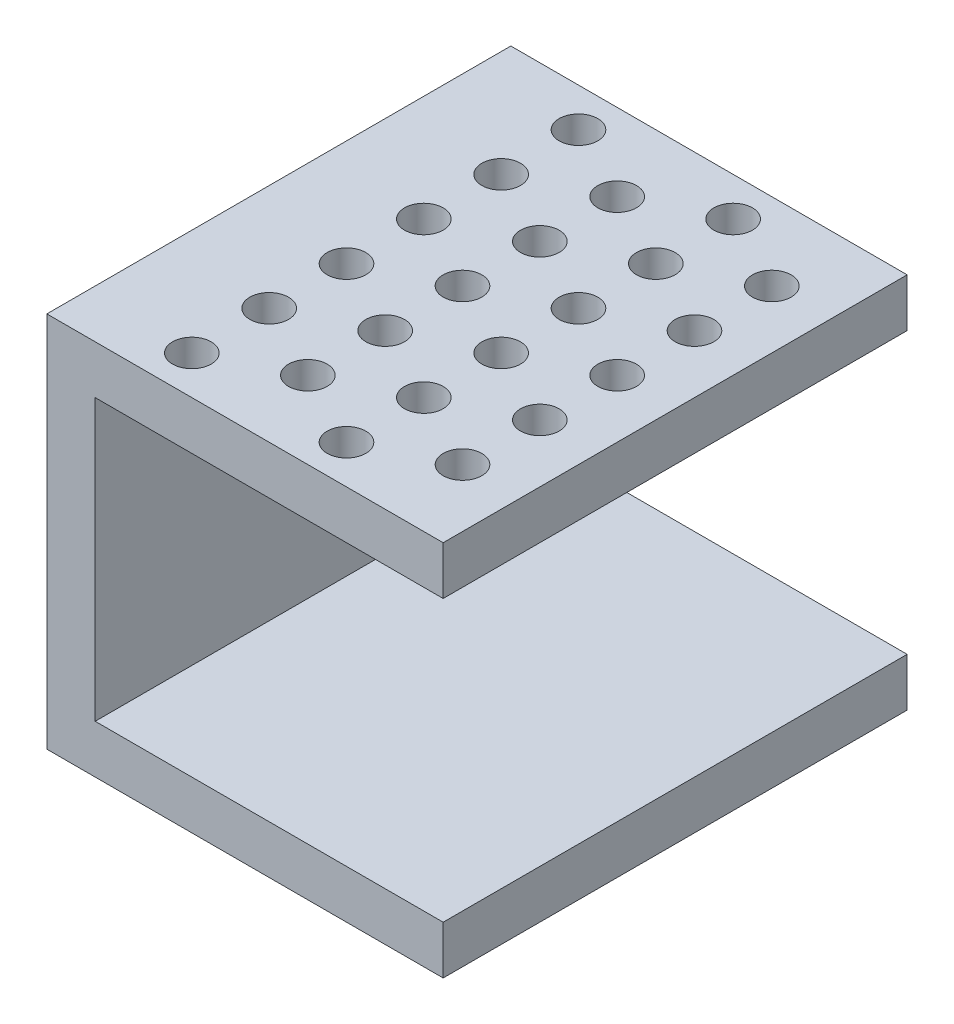
ISO-10303-21;
HEADER;
FILE_DESCRIPTION(('STEP AP214'),'2;1');
FILE_NAME('part.step','',(''),(''),'','','');
FILE_SCHEMA(('AUTOMOTIVE_DESIGN { 1 0 10303 214 1 1 1 1 }'));
ENDSEC;
DATA;
#1=APPLICATION_CONTEXT('core data for automotive mechanical design processes');
#2=APPLICATION_PROTOCOL_DEFINITION('international standard','automotive_design',2000,#1);
#3=PRODUCT_CONTEXT('',#1,'mechanical');
#4=PRODUCT('Part','Part','',(#3));
#5=PRODUCT_RELATED_PRODUCT_CATEGORY('part','',(#4));
#6=PRODUCT_DEFINITION_FORMATION('','',#4);
#7=PRODUCT_DEFINITION_CONTEXT('part definition',#1,'design');
#8=PRODUCT_DEFINITION('design','',#6,#7);
#9=PRODUCT_DEFINITION_SHAPE('','',#8);
#10=(LENGTH_UNIT() NAMED_UNIT(*) SI_UNIT(.MILLI.,.METRE.));
#11=(NAMED_UNIT(*) PLANE_ANGLE_UNIT() SI_UNIT($,.RADIAN.));
#12=(NAMED_UNIT(*) SI_UNIT($,.STERADIAN.) SOLID_ANGLE_UNIT());
#13=UNCERTAINTY_MEASURE_WITH_UNIT(LENGTH_MEASURE(1.E-05),#10,'distance_accuracy_value','');
#14=(GEOMETRIC_REPRESENTATION_CONTEXT(3) GLOBAL_UNCERTAINTY_ASSIGNED_CONTEXT((#13)) GLOBAL_UNIT_ASSIGNED_CONTEXT((#10,
#11,#12)) REPRESENTATION_CONTEXT('',''));
#15=CARTESIAN_POINT('',(0.,0.,0.));
#16=DIRECTION('',(0.,0.,1.));
#17=DIRECTION('',(1.,0.,0.));
#18=AXIS2_PLACEMENT_3D('',#15,#16,#17);
#19=CARTESIAN_POINT('',(-20.,-17.,8.));
#20=DIRECTION('',(-1.,0.,0.));
#21=DIRECTION('',(0.,0.,1.));
#22=AXIS2_PLACEMENT_3D('',#19,#20,#21);
#23=PLANE('',#22);
#24=DIRECTION('',(0.,0.,1.));
#25=VECTOR('',#24,1.);
#26=CARTESIAN_POINT('',(-20.,-14.5,8.));
#27=LINE('',#26,#25);
#28=CARTESIAN_POINT('',(-20.,-14.5,-16.));
#29=VERTEX_POINT('',#28);
#30=CARTESIAN_POINT('',(-20.,-14.5,8.));
#31=VERTEX_POINT('',#30);
#32=EDGE_CURVE('E258',#29,#31,#27,.T.);
#33=ORIENTED_EDGE('',*,*,#32,.F.);
#34=DIRECTION('',(0.,1.,0.));
#35=VECTOR('',#34,1.);
#36=CARTESIAN_POINT('',(-20.,-17.,-16.));
#37=LINE('',#36,#35);
#38=CARTESIAN_POINT('',(-20.,0.,-16.));
#39=VERTEX_POINT('',#38);
#40=EDGE_CURVE('E50',#29,#39,#37,.T.);
#41=ORIENTED_EDGE('',*,*,#40,.T.);
#42=DIRECTION('',(0.,0.,1.));
#43=VECTOR('',#42,1.);
#44=CARTESIAN_POINT('',(-20.,0.,8.));
#45=LINE('',#44,#43);
#46=CARTESIAN_POINT('',(-20.,0.,8.));
#47=VERTEX_POINT('',#46);
#48=EDGE_CURVE('E88',#39,#47,#45,.T.);
#49=ORIENTED_EDGE('',*,*,#48,.T.);
#50=DIRECTION('',(0.,1.,0.));
#51=VECTOR('',#50,1.);
#52=CARTESIAN_POINT('',(-20.,-17.,8.));
#53=LINE('',#52,#51);
#54=EDGE_CURVE('E237',#31,#47,#53,.T.);
#55=ORIENTED_EDGE('',*,*,#54,.F.);
#56=EDGE_LOOP('',(#33,#41,#49,#55));
#57=FACE_BOUND('',#56,.T.);
#58=ADVANCED_FACE('F35',(#57),#23,.F.);
#59=CARTESIAN_POINT('',(0.,0.,0.));
#60=DIRECTION('',(0.,1.,0.));
#61=DIRECTION('',(0.,0.,1.));
#62=AXIS2_PLACEMENT_3D('',#59,#60,#61);
#63=PLANE('',#62);
#64=CARTESIAN_POINT('',(-5.,0.,-12.));
#65=DIRECTION('',(0.,1.,0.));
#66=DIRECTION('',(0.,0.,1.));
#67=AXIS2_PLACEMENT_3D('',#64,#65,#66);
#68=CIRCLE('',#67,1.);
#69=CARTESIAN_POINT('',(-5.,0.,-11.));
#70=VERTEX_POINT('',#69);
#71=EDGE_CURVE('E223',#70,#70,#68,.T.);
#72=ORIENTED_EDGE('',*,*,#71,.T.);
#73=EDGE_LOOP('',(#72));
#74=FACE_BOUND('',#73,.T.);
#75=CARTESIAN_POINT('',(-5.,0.,-8.));
#76=DIRECTION('',(0.,1.,0.));
#77=DIRECTION('',(0.,0.,1.));
#78=AXIS2_PLACEMENT_3D('',#75,#76,#77);
#79=CIRCLE('',#78,1.);
#80=CARTESIAN_POINT('',(-5.,0.,-7.));
#81=VERTEX_POINT('',#80);
#82=EDGE_CURVE('E217',#81,#81,#79,.T.);
#83=ORIENTED_EDGE('',*,*,#82,.T.);
#84=EDGE_LOOP('',(#83));
#85=FACE_BOUND('',#84,.T.);
#86=CARTESIAN_POINT('',(-5.,0.,-4.));
#87=DIRECTION('',(0.,1.,0.));
#88=DIRECTION('',(0.,0.,1.));
#89=AXIS2_PLACEMENT_3D('',#86,#87,#88);
#90=CIRCLE('',#89,1.);
#91=CARTESIAN_POINT('',(-5.,0.,-3.));
#92=VERTEX_POINT('',#91);
#93=EDGE_CURVE('E211',#92,#92,#90,.T.);
#94=ORIENTED_EDGE('',*,*,#93,.T.);
#95=EDGE_LOOP('',(#94));
#96=FACE_BOUND('',#95,.T.);
#97=CARTESIAN_POINT('',(-5.,0.,0.));
#98=DIRECTION('',(0.,1.,0.));
#99=DIRECTION('',(0.,0.,1.));
#100=AXIS2_PLACEMENT_3D('',#97,#98,#99);
#101=CIRCLE('',#100,1.);
#102=CARTESIAN_POINT('',(-5.,0.,1.));
#103=VERTEX_POINT('',#102);
#104=EDGE_CURVE('E205',#103,#103,#101,.T.);
#105=ORIENTED_EDGE('',*,*,#104,.T.);
#106=EDGE_LOOP('',(#105));
#107=FACE_BOUND('',#106,.T.);
#108=CARTESIAN_POINT('',(-5.,0.,4.));
#109=DIRECTION('',(0.,1.,0.));
#110=DIRECTION('',(0.,0.,1.));
#111=AXIS2_PLACEMENT_3D('',#108,#109,#110);
#112=CIRCLE('',#111,1.);
#113=CARTESIAN_POINT('',(-5.,0.,5.));
#114=VERTEX_POINT('',#113);
#115=EDGE_CURVE('E199',#114,#114,#112,.T.);
#116=ORIENTED_EDGE('',*,*,#115,.T.);
#117=EDGE_LOOP('',(#116));
#118=FACE_BOUND('',#117,.T.);
#119=CARTESIAN_POINT('',(-9.,0.,-14.));
#120=DIRECTION('',(0.,1.,0.));
#121=DIRECTION('',(0.,0.,1.));
#122=AXIS2_PLACEMENT_3D('',#119,#120,#121);
#123=CIRCLE('',#122,1.);
#124=CARTESIAN_POINT('',(-9.,0.,-13.));
#125=VERTEX_POINT('',#124);
#126=EDGE_CURVE('E193',#125,#125,#123,.T.);
#127=ORIENTED_EDGE('',*,*,#126,.T.);
#128=EDGE_LOOP('',(#127));
#129=FACE_BOUND('',#128,.T.);
#130=CARTESIAN_POINT('',(-9.,0.,-10.));
#131=DIRECTION('',(0.,1.,0.));
#132=DIRECTION('',(0.,0.,1.));
#133=AXIS2_PLACEMENT_3D('',#130,#131,#132);
#134=CIRCLE('',#133,1.);
#135=CARTESIAN_POINT('',(-9.,0.,-9.));
#136=VERTEX_POINT('',#135);
#137=EDGE_CURVE('E187',#136,#136,#134,.T.);
#138=ORIENTED_EDGE('',*,*,#137,.T.);
#139=EDGE_LOOP('',(#138));
#140=FACE_BOUND('',#139,.T.);
#141=CARTESIAN_POINT('',(-9.,0.,-6.));
#142=DIRECTION('',(0.,1.,0.));
#143=DIRECTION('',(0.,0.,1.));
#144=AXIS2_PLACEMENT_3D('',#141,#142,#143);
#145=CIRCLE('',#144,1.);
#146=CARTESIAN_POINT('',(-9.,0.,-5.));
#147=VERTEX_POINT('',#146);
#148=EDGE_CURVE('E181',#147,#147,#145,.T.);
#149=ORIENTED_EDGE('',*,*,#148,.T.);
#150=EDGE_LOOP('',(#149));
#151=FACE_BOUND('',#150,.T.);
#152=CARTESIAN_POINT('',(-9.,0.,-2.));
#153=DIRECTION('',(0.,1.,0.));
#154=DIRECTION('',(0.,0.,1.));
#155=AXIS2_PLACEMENT_3D('',#152,#153,#154);
#156=CIRCLE('',#155,1.);
#157=CARTESIAN_POINT('',(-9.,0.,-0.999999999999999));
#158=VERTEX_POINT('',#157);
#159=EDGE_CURVE('E175',#158,#158,#156,.T.);
#160=ORIENTED_EDGE('',*,*,#159,.T.);
#161=EDGE_LOOP('',(#160));
#162=FACE_BOUND('',#161,.T.);
#163=CARTESIAN_POINT('',(-9.,0.,2.));
#164=DIRECTION('',(0.,1.,0.));
#165=DIRECTION('',(0.,0.,1.));
#166=AXIS2_PLACEMENT_3D('',#163,#164,#165);
#167=CIRCLE('',#166,1.);
#168=CARTESIAN_POINT('',(-9.,0.,3.));
#169=VERTEX_POINT('',#168);
#170=EDGE_CURVE('E169',#169,#169,#167,.T.);
#171=ORIENTED_EDGE('',*,*,#170,.T.);
#172=EDGE_LOOP('',(#171));
#173=FACE_BOUND('',#172,.T.);
#174=CARTESIAN_POINT('',(-9.,0.,6.));
#175=DIRECTION('',(0.,1.,0.));
#176=DIRECTION('',(0.,0.,1.));
#177=AXIS2_PLACEMENT_3D('',#174,#175,#176);
#178=CIRCLE('',#177,1.);
#179=CARTESIAN_POINT('',(-9.,0.,7.));
#180=VERTEX_POINT('',#179);
#181=EDGE_CURVE('E163',#180,#180,#178,.T.);
#182=ORIENTED_EDGE('',*,*,#181,.T.);
#183=EDGE_LOOP('',(#182));
#184=FACE_BOUND('',#183,.T.);
#185=CARTESIAN_POINT('',(-13.,0.,-12.));
#186=DIRECTION('',(0.,1.,0.));
#187=DIRECTION('',(0.,0.,1.));
#188=AXIS2_PLACEMENT_3D('',#185,#186,#187);
#189=CIRCLE('',#188,1.);
#190=CARTESIAN_POINT('',(-13.,0.,-11.));
#191=VERTEX_POINT('',#190);
#192=EDGE_CURVE('E157',#191,#191,#189,.T.);
#193=ORIENTED_EDGE('',*,*,#192,.T.);
#194=EDGE_LOOP('',(#193));
#195=FACE_BOUND('',#194,.T.);
#196=CARTESIAN_POINT('',(-13.,0.,-8.));
#197=DIRECTION('',(0.,1.,0.));
#198=DIRECTION('',(0.,0.,1.));
#199=AXIS2_PLACEMENT_3D('',#196,#197,#198);
#200=CIRCLE('',#199,1.00000000000001);
#201=CARTESIAN_POINT('',(-13.,0.,-6.99999999999999));
#202=VERTEX_POINT('',#201);
#203=EDGE_CURVE('E151',#202,#202,#200,.T.);
#204=ORIENTED_EDGE('',*,*,#203,.T.);
#205=EDGE_LOOP('',(#204));
#206=FACE_BOUND('',#205,.T.);
#207=CARTESIAN_POINT('',(-13.,0.,-4.));
#208=DIRECTION('',(0.,1.,0.));
#209=DIRECTION('',(0.,0.,1.));
#210=AXIS2_PLACEMENT_3D('',#207,#208,#209);
#211=CIRCLE('',#210,1.);
#212=CARTESIAN_POINT('',(-13.,0.,-3.));
#213=VERTEX_POINT('',#212);
#214=EDGE_CURVE('E145',#213,#213,#211,.T.);
#215=ORIENTED_EDGE('',*,*,#214,.T.);
#216=EDGE_LOOP('',(#215));
#217=FACE_BOUND('',#216,.T.);
#218=CARTESIAN_POINT('',(-13.,0.,0.));
#219=DIRECTION('',(0.,1.,0.));
#220=DIRECTION('',(0.,0.,1.));
#221=AXIS2_PLACEMENT_3D('',#218,#219,#220);
#222=CIRCLE('',#221,1.);
#223=CARTESIAN_POINT('',(-13.,0.,1.));
#224=VERTEX_POINT('',#223);
#225=EDGE_CURVE('E139',#224,#224,#222,.T.);
#226=ORIENTED_EDGE('',*,*,#225,.T.);
#227=EDGE_LOOP('',(#226));
#228=FACE_BOUND('',#227,.T.);
#229=CARTESIAN_POINT('',(-13.,0.,4.));
#230=DIRECTION('',(0.,1.,0.));
#231=DIRECTION('',(0.,0.,1.));
#232=AXIS2_PLACEMENT_3D('',#229,#230,#231);
#233=CIRCLE('',#232,1.);
#234=CARTESIAN_POINT('',(-13.,0.,5.));
#235=VERTEX_POINT('',#234);
#236=EDGE_CURVE('E133',#235,#235,#233,.T.);
#237=ORIENTED_EDGE('',*,*,#236,.T.);
#238=EDGE_LOOP('',(#237));
#239=FACE_BOUND('',#238,.T.);
#240=CARTESIAN_POINT('',(-17.,0.,-14.));
#241=DIRECTION('',(0.,1.,0.));
#242=DIRECTION('',(0.,0.,1.));
#243=AXIS2_PLACEMENT_3D('',#240,#241,#242);
#244=CIRCLE('',#243,1.);
#245=CARTESIAN_POINT('',(-17.,0.,-13.));
#246=VERTEX_POINT('',#245);
#247=EDGE_CURVE('E127',#246,#246,#244,.T.);
#248=ORIENTED_EDGE('',*,*,#247,.T.);
#249=EDGE_LOOP('',(#248));
#250=FACE_BOUND('',#249,.T.);
#251=CARTESIAN_POINT('',(-17.,0.,-10.));
#252=DIRECTION('',(0.,1.,0.));
#253=DIRECTION('',(0.,0.,1.));
#254=AXIS2_PLACEMENT_3D('',#251,#252,#253);
#255=CIRCLE('',#254,1.);
#256=CARTESIAN_POINT('',(-17.,0.,-9.));
#257=VERTEX_POINT('',#256);
#258=EDGE_CURVE('E121',#257,#257,#255,.T.);
#259=ORIENTED_EDGE('',*,*,#258,.T.);
#260=EDGE_LOOP('',(#259));
#261=FACE_BOUND('',#260,.T.);
#262=CARTESIAN_POINT('',(-17.,0.,-6.));
#263=DIRECTION('',(0.,1.,0.));
#264=DIRECTION('',(0.,0.,1.));
#265=AXIS2_PLACEMENT_3D('',#262,#263,#264);
#266=CIRCLE('',#265,1.);
#267=CARTESIAN_POINT('',(-17.,0.,-5.));
#268=VERTEX_POINT('',#267);
#269=EDGE_CURVE('E115',#268,#268,#266,.T.);
#270=ORIENTED_EDGE('',*,*,#269,.T.);
#271=EDGE_LOOP('',(#270));
#272=FACE_BOUND('',#271,.T.);
#273=CARTESIAN_POINT('',(-17.,0.,-2.));
#274=DIRECTION('',(0.,1.,0.));
#275=DIRECTION('',(0.,0.,1.));
#276=AXIS2_PLACEMENT_3D('',#273,#274,#275);
#277=CIRCLE('',#276,1.);
#278=CARTESIAN_POINT('',(-17.,0.,-0.999999999999999));
#279=VERTEX_POINT('',#278);
#280=EDGE_CURVE('E109',#279,#279,#277,.T.);
#281=ORIENTED_EDGE('',*,*,#280,.T.);
#282=EDGE_LOOP('',(#281));
#283=FACE_BOUND('',#282,.T.);
#284=CARTESIAN_POINT('',(-17.,0.,2.));
#285=DIRECTION('',(0.,1.,0.));
#286=DIRECTION('',(0.,0.,1.));
#287=AXIS2_PLACEMENT_3D('',#284,#285,#286);
#288=CIRCLE('',#287,1.);
#289=CARTESIAN_POINT('',(-17.,0.,3.));
#290=VERTEX_POINT('',#289);
#291=EDGE_CURVE('E103',#290,#290,#288,.T.);
#292=ORIENTED_EDGE('',*,*,#291,.T.);
#293=EDGE_LOOP('',(#292));
#294=FACE_BOUND('',#293,.T.);
#295=CARTESIAN_POINT('',(-17.,0.,6.));
#296=DIRECTION('',(0.,1.,0.));
#297=DIRECTION('',(0.,0.,1.));
#298=AXIS2_PLACEMENT_3D('',#295,#296,#297);
#299=CIRCLE('',#298,1.);
#300=CARTESIAN_POINT('',(-17.,0.,7.));
#301=VERTEX_POINT('',#300);
#302=EDGE_CURVE('E97',#301,#301,#299,.T.);
#303=ORIENTED_EDGE('',*,*,#302,.T.);
#304=EDGE_LOOP('',(#303));
#305=FACE_BOUND('',#304,.T.);
#306=ORIENTED_EDGE('',*,*,#48,.F.);
#307=DIRECTION('',(-1.,0.,0.));
#308=VECTOR('',#307,1.);
#309=CARTESIAN_POINT('',(-20.,0.,-16.));
#310=LINE('',#309,#308);
#311=CARTESIAN_POINT('',(-2.,0.,-16.));
#312=VERTEX_POINT('',#311);
#313=EDGE_CURVE('E79',#312,#39,#310,.T.);
#314=ORIENTED_EDGE('',*,*,#313,.F.);
#315=DIRECTION('',(0.,0.,-1.));
#316=VECTOR('',#315,1.);
#317=CARTESIAN_POINT('',(-2.,0.,-16.));
#318=LINE('',#317,#316);
#319=CARTESIAN_POINT('',(-2.,0.,8.));
#320=VERTEX_POINT('',#319);
#321=EDGE_CURVE('E71',#320,#312,#318,.T.);
#322=ORIENTED_EDGE('',*,*,#321,.F.);
#323=DIRECTION('',(1.,0.,0.));
#324=VECTOR('',#323,1.);
#325=CARTESIAN_POINT('',(-20.,0.,8.));
#326=LINE('',#325,#324);
#327=EDGE_CURVE('E80',#47,#320,#326,.T.);
#328=ORIENTED_EDGE('',*,*,#327,.F.);
#329=EDGE_LOOP('',(#306,#314,#322,#328));
#330=FACE_BOUND('',#329,.T.);
#331=ADVANCED_FACE('F87',(#74,#85,#96,#107,#118,#129,#140,#151,#162,#173,#184,#195,#206,#217,
#228,#239,#250,#261,#272,#283,#294,#305,#330),#63,.F.);
#332=CARTESIAN_POINT('',(0.,2.5,0.));
#333=DIRECTION('',(0.,1.,0.));
#334=DIRECTION('',(0.,0.,1.));
#335=AXIS2_PLACEMENT_3D('',#332,#333,#334);
#336=PLANE('',#335);
#337=CARTESIAN_POINT('',(-5.,2.5,-8.));
#338=DIRECTION('',(0.,1.,0.));
#339=DIRECTION('',(0.,0.,1.));
#340=AXIS2_PLACEMENT_3D('',#337,#338,#339);
#341=CIRCLE('',#340,1.);
#342=CARTESIAN_POINT('',(-5.,2.5,-7.));
#343=VERTEX_POINT('',#342);
#344=EDGE_CURVE('E214',#343,#343,#341,.T.);
#345=ORIENTED_EDGE('',*,*,#344,.F.);
#346=EDGE_LOOP('',(#345));
#347=FACE_BOUND('',#346,.T.);
#348=CARTESIAN_POINT('',(-5.,2.5,0.));
#349=DIRECTION('',(0.,1.,0.));
#350=DIRECTION('',(0.,0.,1.));
#351=AXIS2_PLACEMENT_3D('',#348,#349,#350);
#352=CIRCLE('',#351,1.);
#353=CARTESIAN_POINT('',(-5.,2.5,1.));
#354=VERTEX_POINT('',#353);
#355=EDGE_CURVE('E202',#354,#354,#352,.T.);
#356=ORIENTED_EDGE('',*,*,#355,.F.);
#357=EDGE_LOOP('',(#356));
#358=FACE_BOUND('',#357,.T.);
#359=CARTESIAN_POINT('',(-9.,2.5,-14.));
#360=DIRECTION('',(0.,1.,0.));
#361=DIRECTION('',(0.,0.,1.));
#362=AXIS2_PLACEMENT_3D('',#359,#360,#361);
#363=CIRCLE('',#362,1.);
#364=CARTESIAN_POINT('',(-9.,2.5,-13.));
#365=VERTEX_POINT('',#364);
#366=EDGE_CURVE('E190',#365,#365,#363,.T.);
#367=ORIENTED_EDGE('',*,*,#366,.F.);
#368=EDGE_LOOP('',(#367));
#369=FACE_BOUND('',#368,.T.);
#370=CARTESIAN_POINT('',(-9.,2.5,-6.));
#371=DIRECTION('',(0.,1.,0.));
#372=DIRECTION('',(0.,0.,1.));
#373=AXIS2_PLACEMENT_3D('',#370,#371,#372);
#374=CIRCLE('',#373,1.);
#375=CARTESIAN_POINT('',(-9.,2.5,-5.));
#376=VERTEX_POINT('',#375);
#377=EDGE_CURVE('E178',#376,#376,#374,.T.);
#378=ORIENTED_EDGE('',*,*,#377,.F.);
#379=EDGE_LOOP('',(#378));
#380=FACE_BOUND('',#379,.T.);
#381=CARTESIAN_POINT('',(-9.,2.5,2.));
#382=DIRECTION('',(0.,1.,0.));
#383=DIRECTION('',(0.,0.,1.));
#384=AXIS2_PLACEMENT_3D('',#381,#382,#383);
#385=CIRCLE('',#384,1.);
#386=CARTESIAN_POINT('',(-9.,2.5,3.));
#387=VERTEX_POINT('',#386);
#388=EDGE_CURVE('E166',#387,#387,#385,.T.);
#389=ORIENTED_EDGE('',*,*,#388,.F.);
#390=EDGE_LOOP('',(#389));
#391=FACE_BOUND('',#390,.T.);
#392=CARTESIAN_POINT('',(-13.,2.5,-12.));
#393=DIRECTION('',(0.,1.,0.));
#394=DIRECTION('',(0.,0.,1.));
#395=AXIS2_PLACEMENT_3D('',#392,#393,#394);
#396=CIRCLE('',#395,1.);
#397=CARTESIAN_POINT('',(-13.,2.5,-11.));
#398=VERTEX_POINT('',#397);
#399=EDGE_CURVE('E154',#398,#398,#396,.T.);
#400=ORIENTED_EDGE('',*,*,#399,.F.);
#401=EDGE_LOOP('',(#400));
#402=FACE_BOUND('',#401,.T.);
#403=CARTESIAN_POINT('',(-13.,2.5,-4.));
#404=DIRECTION('',(0.,1.,0.));
#405=DIRECTION('',(0.,0.,1.));
#406=AXIS2_PLACEMENT_3D('',#403,#404,#405);
#407=CIRCLE('',#406,1.);
#408=CARTESIAN_POINT('',(-13.,2.5,-3.));
#409=VERTEX_POINT('',#408);
#410=EDGE_CURVE('E142',#409,#409,#407,.T.);
#411=ORIENTED_EDGE('',*,*,#410,.F.);
#412=EDGE_LOOP('',(#411));
#413=FACE_BOUND('',#412,.T.);
#414=CARTESIAN_POINT('',(-13.,2.5,4.));
#415=DIRECTION('',(0.,1.,0.));
#416=DIRECTION('',(0.,0.,1.));
#417=AXIS2_PLACEMENT_3D('',#414,#415,#416);
#418=CIRCLE('',#417,1.);
#419=CARTESIAN_POINT('',(-13.,2.5,5.));
#420=VERTEX_POINT('',#419);
#421=EDGE_CURVE('E130',#420,#420,#418,.T.);
#422=ORIENTED_EDGE('',*,*,#421,.F.);
#423=EDGE_LOOP('',(#422));
#424=FACE_BOUND('',#423,.T.);
#425=CARTESIAN_POINT('',(-17.,2.5,-10.));
#426=DIRECTION('',(0.,1.,0.));
#427=DIRECTION('',(0.,0.,1.));
#428=AXIS2_PLACEMENT_3D('',#425,#426,#427);
#429=CIRCLE('',#428,1.);
#430=CARTESIAN_POINT('',(-17.,2.5,-9.));
#431=VERTEX_POINT('',#430);
#432=EDGE_CURVE('E118',#431,#431,#429,.T.);
#433=ORIENTED_EDGE('',*,*,#432,.F.);
#434=EDGE_LOOP('',(#433));
#435=FACE_BOUND('',#434,.T.);
#436=CARTESIAN_POINT('',(-17.,2.5,-2.));
#437=DIRECTION('',(0.,1.,0.));
#438=DIRECTION('',(0.,0.,1.));
#439=AXIS2_PLACEMENT_3D('',#436,#437,#438);
#440=CIRCLE('',#439,1.);
#441=CARTESIAN_POINT('',(-17.,2.5,-0.999999999999999));
#442=VERTEX_POINT('',#441);
#443=EDGE_CURVE('E106',#442,#442,#440,.T.);
#444=ORIENTED_EDGE('',*,*,#443,.F.);
#445=EDGE_LOOP('',(#444));
#446=FACE_BOUND('',#445,.T.);
#447=CARTESIAN_POINT('',(-17.,2.5,6.));
#448=DIRECTION('',(0.,1.,0.));
#449=DIRECTION('',(0.,0.,1.));
#450=AXIS2_PLACEMENT_3D('',#447,#448,#449);
#451=CIRCLE('',#450,1.);
#452=CARTESIAN_POINT('',(-17.,2.5,7.));
#453=VERTEX_POINT('',#452);
#454=EDGE_CURVE('E94',#453,#453,#451,.T.);
#455=ORIENTED_EDGE('',*,*,#454,.F.);
#456=EDGE_LOOP('',(#455));
#457=FACE_BOUND('',#456,.T.);
#458=DIRECTION('',(-1.,0.,0.));
#459=VECTOR('',#458,1.);
#460=CARTESIAN_POINT('',(-20.,2.5,-16.));
#461=LINE('',#460,#459);
#462=CARTESIAN_POINT('',(-2.,2.5,-16.));
#463=VERTEX_POINT('',#462);
#464=CARTESIAN_POINT('',(-22.5,2.5,-16.));
#465=VERTEX_POINT('',#464);
#466=EDGE_CURVE('E86',#463,#465,#461,.T.);
#467=ORIENTED_EDGE('',*,*,#466,.T.);
#468=DIRECTION('',(0.,0.,-1.));
#469=VECTOR('',#468,1.);
#470=CARTESIAN_POINT('',(-22.5,2.5,-16.));
#471=LINE('',#470,#469);
#472=CARTESIAN_POINT('',(-22.5,2.5,8.));
#473=VERTEX_POINT('',#472);
#474=EDGE_CURVE('E226',#473,#465,#471,.T.);
#475=ORIENTED_EDGE('',*,*,#474,.F.);
#476=DIRECTION('',(1.,0.,0.));
#477=VECTOR('',#476,1.);
#478=CARTESIAN_POINT('',(-20.,2.5,8.));
#479=LINE('',#478,#477);
#480=CARTESIAN_POINT('',(-2.,2.5,8.));
#481=VERTEX_POINT('',#480);
#482=EDGE_CURVE('E89',#473,#481,#479,.T.);
#483=ORIENTED_EDGE('',*,*,#482,.T.);
#484=DIRECTION('',(0.,0.,-1.));
#485=VECTOR('',#484,1.);
#486=CARTESIAN_POINT('',(-2.,2.5,-16.));
#487=LINE('',#486,#485);
#488=EDGE_CURVE('E59',#481,#463,#487,.T.);
#489=ORIENTED_EDGE('',*,*,#488,.T.);
#490=EDGE_LOOP('',(#467,#475,#483,#489));
#491=FACE_BOUND('',#490,.T.);
#492=CARTESIAN_POINT('',(-17.,2.5,2.));
#493=DIRECTION('',(0.,1.,0.));
#494=DIRECTION('',(0.,0.,1.));
#495=AXIS2_PLACEMENT_3D('',#492,#493,#494);
#496=CIRCLE('',#495,1.);
#497=CARTESIAN_POINT('',(-17.,2.5,3.));
#498=VERTEX_POINT('',#497);
#499=EDGE_CURVE('E100',#498,#498,#496,.T.);
#500=ORIENTED_EDGE('',*,*,#499,.F.);
#501=EDGE_LOOP('',(#500));
#502=FACE_BOUND('',#501,.T.);
#503=CARTESIAN_POINT('',(-17.,2.5,-6.));
#504=DIRECTION('',(0.,1.,0.));
#505=DIRECTION('',(0.,0.,1.));
#506=AXIS2_PLACEMENT_3D('',#503,#504,#505);
#507=CIRCLE('',#506,1.);
#508=CARTESIAN_POINT('',(-17.,2.5,-5.));
#509=VERTEX_POINT('',#508);
#510=EDGE_CURVE('E112',#509,#509,#507,.T.);
#511=ORIENTED_EDGE('',*,*,#510,.F.);
#512=EDGE_LOOP('',(#511));
#513=FACE_BOUND('',#512,.T.);
#514=CARTESIAN_POINT('',(-17.,2.5,-14.));
#515=DIRECTION('',(0.,1.,0.));
#516=DIRECTION('',(0.,0.,1.));
#517=AXIS2_PLACEMENT_3D('',#514,#515,#516);
#518=CIRCLE('',#517,1.);
#519=CARTESIAN_POINT('',(-17.,2.5,-13.));
#520=VERTEX_POINT('',#519);
#521=EDGE_CURVE('E124',#520,#520,#518,.T.);
#522=ORIENTED_EDGE('',*,*,#521,.F.);
#523=EDGE_LOOP('',(#522));
#524=FACE_BOUND('',#523,.T.);
#525=CARTESIAN_POINT('',(-13.,2.5,0.));
#526=DIRECTION('',(0.,1.,0.));
#527=DIRECTION('',(0.,0.,1.));
#528=AXIS2_PLACEMENT_3D('',#525,#526,#527);
#529=CIRCLE('',#528,1.);
#530=CARTESIAN_POINT('',(-13.,2.5,1.));
#531=VERTEX_POINT('',#530);
#532=EDGE_CURVE('E136',#531,#531,#529,.T.);
#533=ORIENTED_EDGE('',*,*,#532,.F.);
#534=EDGE_LOOP('',(#533));
#535=FACE_BOUND('',#534,.T.);
#536=CARTESIAN_POINT('',(-13.,2.5,-8.));
#537=DIRECTION('',(0.,1.,0.));
#538=DIRECTION('',(0.,0.,1.));
#539=AXIS2_PLACEMENT_3D('',#536,#537,#538);
#540=CIRCLE('',#539,1.00000000000001);
#541=CARTESIAN_POINT('',(-13.,2.5,-6.99999999999999));
#542=VERTEX_POINT('',#541);
#543=EDGE_CURVE('E148',#542,#542,#540,.T.);
#544=ORIENTED_EDGE('',*,*,#543,.F.);
#545=EDGE_LOOP('',(#544));
#546=FACE_BOUND('',#545,.T.);
#547=CARTESIAN_POINT('',(-9.,2.5,6.));
#548=DIRECTION('',(0.,1.,0.));
#549=DIRECTION('',(0.,0.,1.));
#550=AXIS2_PLACEMENT_3D('',#547,#548,#549);
#551=CIRCLE('',#550,1.);
#552=CARTESIAN_POINT('',(-9.,2.5,7.));
#553=VERTEX_POINT('',#552);
#554=EDGE_CURVE('E160',#553,#553,#551,.T.);
#555=ORIENTED_EDGE('',*,*,#554,.F.);
#556=EDGE_LOOP('',(#555));
#557=FACE_BOUND('',#556,.T.);
#558=CARTESIAN_POINT('',(-9.,2.5,-2.));
#559=DIRECTION('',(0.,1.,0.));
#560=DIRECTION('',(0.,0.,1.));
#561=AXIS2_PLACEMENT_3D('',#558,#559,#560);
#562=CIRCLE('',#561,1.);
#563=CARTESIAN_POINT('',(-9.,2.5,-0.999999999999999));
#564=VERTEX_POINT('',#563);
#565=EDGE_CURVE('E172',#564,#564,#562,.T.);
#566=ORIENTED_EDGE('',*,*,#565,.F.);
#567=EDGE_LOOP('',(#566));
#568=FACE_BOUND('',#567,.T.);
#569=CARTESIAN_POINT('',(-9.,2.5,-10.));
#570=DIRECTION('',(0.,1.,0.));
#571=DIRECTION('',(0.,0.,1.));
#572=AXIS2_PLACEMENT_3D('',#569,#570,#571);
#573=CIRCLE('',#572,1.);
#574=CARTESIAN_POINT('',(-9.,2.5,-9.));
#575=VERTEX_POINT('',#574);
#576=EDGE_CURVE('E184',#575,#575,#573,.T.);
#577=ORIENTED_EDGE('',*,*,#576,.F.);
#578=EDGE_LOOP('',(#577));
#579=FACE_BOUND('',#578,.T.);
#580=CARTESIAN_POINT('',(-5.,2.5,4.));
#581=DIRECTION('',(0.,1.,0.));
#582=DIRECTION('',(0.,0.,1.));
#583=AXIS2_PLACEMENT_3D('',#580,#581,#582);
#584=CIRCLE('',#583,1.);
#585=CARTESIAN_POINT('',(-5.,2.5,5.));
#586=VERTEX_POINT('',#585);
#587=EDGE_CURVE('E196',#586,#586,#584,.T.);
#588=ORIENTED_EDGE('',*,*,#587,.F.);
#589=EDGE_LOOP('',(#588));
#590=FACE_BOUND('',#589,.T.);
#591=CARTESIAN_POINT('',(-5.,2.5,-4.));
#592=DIRECTION('',(0.,1.,0.));
#593=DIRECTION('',(0.,0.,1.));
#594=AXIS2_PLACEMENT_3D('',#591,#592,#593);
#595=CIRCLE('',#594,1.);
#596=CARTESIAN_POINT('',(-5.,2.5,-3.));
#597=VERTEX_POINT('',#596);
#598=EDGE_CURVE('E208',#597,#597,#595,.T.);
#599=ORIENTED_EDGE('',*,*,#598,.F.);
#600=EDGE_LOOP('',(#599));
#601=FACE_BOUND('',#600,.T.);
#602=CARTESIAN_POINT('',(-5.,2.5,-12.));
#603=DIRECTION('',(0.,1.,0.));
#604=DIRECTION('',(0.,0.,1.));
#605=AXIS2_PLACEMENT_3D('',#602,#603,#604);
#606=CIRCLE('',#605,1.);
#607=CARTESIAN_POINT('',(-5.,2.5,-11.));
#608=VERTEX_POINT('',#607);
#609=EDGE_CURVE('E220',#608,#608,#606,.T.);
#610=ORIENTED_EDGE('',*,*,#609,.F.);
#611=EDGE_LOOP('',(#610));
#612=FACE_BOUND('',#611,.T.);
#613=ADVANCED_FACE('F304',(#347,#358,#369,#380,#391,#402,#413,#424,#435,#446,#457,#491,#502,
#513,#524,#535,#546,#557,#568,#579,#590,#601,#612),#336,.T.);
#614=CARTESIAN_POINT('',(-20.,2.5,8.));
#615=DIRECTION('',(0.,0.,-1.));
#616=DIRECTION('',(-1.,0.,0.));
#617=AXIS2_PLACEMENT_3D('',#614,#615,#616);
#618=PLANE('',#617);
#619=DIRECTION('',(0.,1.,0.));
#620=VECTOR('',#619,1.);
#621=CARTESIAN_POINT('',(-22.5,0.,8.));
#622=LINE('',#621,#620);
#623=CARTESIAN_POINT('',(-22.5,-17.,8.));
#624=VERTEX_POINT('',#623);
#625=EDGE_CURVE('E231',#624,#473,#622,.T.);
#626=ORIENTED_EDGE('',*,*,#625,.F.);
#627=DIRECTION('',(-1.,0.,0.));
#628=VECTOR('',#627,1.);
#629=CARTESIAN_POINT('',(-22.5,-17.,8.));
#630=LINE('',#629,#628);
#631=CARTESIAN_POINT('',(-2.,-17.,8.));
#632=VERTEX_POINT('',#631);
#633=EDGE_CURVE('E243',#632,#624,#630,.T.);
#634=ORIENTED_EDGE('',*,*,#633,.F.);
#635=DIRECTION('',(0.,-1.,0.));
#636=VECTOR('',#635,1.);
#637=CARTESIAN_POINT('',(-2.,-17.,8.));
#638=LINE('',#637,#636);
#639=CARTESIAN_POINT('',(-2.,-14.5,8.));
#640=VERTEX_POINT('',#639);
#641=EDGE_CURVE('E261',#640,#632,#638,.T.);
#642=ORIENTED_EDGE('',*,*,#641,.F.);
#643=DIRECTION('',(-1.,0.,0.));
#644=VECTOR('',#643,1.);
#645=CARTESIAN_POINT('',(-2.,-14.5,8.));
#646=LINE('',#645,#644);
#647=EDGE_CURVE('E254',#640,#31,#646,.T.);
#648=ORIENTED_EDGE('',*,*,#647,.T.);
#649=ORIENTED_EDGE('',*,*,#54,.T.);
#650=ORIENTED_EDGE('',*,*,#327,.T.);
#651=DIRECTION('',(0.,-1.,0.));
#652=VECTOR('',#651,1.);
#653=CARTESIAN_POINT('',(-2.,2.5,8.));
#654=LINE('',#653,#652);
#655=EDGE_CURVE('E11',#481,#320,#654,.T.);
#656=ORIENTED_EDGE('',*,*,#655,.F.);
#657=ORIENTED_EDGE('',*,*,#482,.F.);
#658=EDGE_LOOP('',(#626,#634,#642,#648,#649,#650,#656,#657));
#659=FACE_BOUND('',#658,.T.);
#660=ADVANCED_FACE('F37',(#659),#618,.F.);
#661=CARTESIAN_POINT('',(-2.,2.5,-16.));
#662=DIRECTION('',(-1.,0.,0.));
#663=DIRECTION('',(0.,0.,1.));
#664=AXIS2_PLACEMENT_3D('',#661,#662,#663);
#665=PLANE('',#664);
#666=ORIENTED_EDGE('',*,*,#321,.T.);
#667=DIRECTION('',(0.,-1.,0.));
#668=VECTOR('',#667,1.);
#669=CARTESIAN_POINT('',(-2.,2.5,-16.));
#670=LINE('',#669,#668);
#671=EDGE_CURVE('E43',#463,#312,#670,.T.);
#672=ORIENTED_EDGE('',*,*,#671,.F.);
#673=ORIENTED_EDGE('',*,*,#488,.F.);
#674=ORIENTED_EDGE('',*,*,#655,.T.);
#675=EDGE_LOOP('',(#666,#672,#673,#674));
#676=FACE_BOUND('',#675,.T.);
#677=ADVANCED_FACE('F73',(#676),#665,.F.);
#678=CARTESIAN_POINT('',(-20.,2.5,-16.));
#679=DIRECTION('',(0.,0.,1.));
#680=DIRECTION('',(1.,0.,0.));
#681=AXIS2_PLACEMENT_3D('',#678,#679,#680);
#682=PLANE('',#681);
#683=ORIENTED_EDGE('',*,*,#313,.T.);
#684=ORIENTED_EDGE('',*,*,#40,.F.);
#685=DIRECTION('',(-1.,0.,0.));
#686=VECTOR('',#685,1.);
#687=CARTESIAN_POINT('',(-2.,-14.5,-16.));
#688=LINE('',#687,#686);
#689=CARTESIAN_POINT('',(-2.,-14.5,-16.));
#690=VERTEX_POINT('',#689);
#691=EDGE_CURVE('E244',#690,#29,#688,.T.);
#692=ORIENTED_EDGE('',*,*,#691,.F.);
#693=DIRECTION('',(0.,1.,0.));
#694=VECTOR('',#693,1.);
#695=CARTESIAN_POINT('',(-2.,-17.,-16.));
#696=LINE('',#695,#694);
#697=CARTESIAN_POINT('',(-2.,-17.,-16.));
#698=VERTEX_POINT('',#697);
#699=EDGE_CURVE('E264',#698,#690,#696,.T.);
#700=ORIENTED_EDGE('',*,*,#699,.F.);
#701=DIRECTION('',(1.,0.,0.));
#702=VECTOR('',#701,1.);
#703=CARTESIAN_POINT('',(-22.5,-17.,-16.));
#704=LINE('',#703,#702);
#705=CARTESIAN_POINT('',(-22.5,-17.,-16.));
#706=VERTEX_POINT('',#705);
#707=EDGE_CURVE('E241',#706,#698,#704,.T.);
#708=ORIENTED_EDGE('',*,*,#707,.F.);
#709=DIRECTION('',(0.,-1.,0.));
#710=VECTOR('',#709,1.);
#711=CARTESIAN_POINT('',(-22.5,0.,-16.));
#712=LINE('',#711,#710);
#713=EDGE_CURVE('E234',#465,#706,#712,.T.);
#714=ORIENTED_EDGE('',*,*,#713,.F.);
#715=ORIENTED_EDGE('',*,*,#466,.F.);
#716=ORIENTED_EDGE('',*,*,#671,.T.);
#717=EDGE_LOOP('',(#683,#684,#692,#700,#708,#714,#715,#716));
#718=FACE_BOUND('',#717,.T.);
#719=ADVANCED_FACE('F84',(#718),#682,.F.);
#720=CARTESIAN_POINT('',(-17.,2.5,6.));
#721=DIRECTION('',(0.,-1.,0.));
#722=DIRECTION('',(0.,0.,-1.));
#723=AXIS2_PLACEMENT_3D('',#720,#721,#722);
#724=CYLINDRICAL_SURFACE('',#723,1.);
#725=ORIENTED_EDGE('',*,*,#454,.T.);
#726=EDGE_LOOP('',(#725));
#727=FACE_BOUND('',#726,.T.);
#728=ORIENTED_EDGE('',*,*,#302,.F.);
#729=EDGE_LOOP('',(#728));
#730=FACE_BOUND('',#729,.T.);
#731=ADVANCED_FACE('F414',(#727,#730),#724,.F.);
#732=CARTESIAN_POINT('',(-17.,2.5,2.));
#733=DIRECTION('',(0.,-1.,0.));
#734=DIRECTION('',(0.,0.,-1.));
#735=AXIS2_PLACEMENT_3D('',#732,#733,#734);
#736=CYLINDRICAL_SURFACE('',#735,1.);
#737=ORIENTED_EDGE('',*,*,#499,.T.);
#738=EDGE_LOOP('',(#737));
#739=FACE_BOUND('',#738,.T.);
#740=ORIENTED_EDGE('',*,*,#291,.F.);
#741=EDGE_LOOP('',(#740));
#742=FACE_BOUND('',#741,.T.);
#743=ADVANCED_FACE('F410',(#739,#742),#736,.F.);
#744=CARTESIAN_POINT('',(-17.,2.5,-2.));
#745=DIRECTION('',(0.,-1.,0.));
#746=DIRECTION('',(0.,0.,-1.));
#747=AXIS2_PLACEMENT_3D('',#744,#745,#746);
#748=CYLINDRICAL_SURFACE('',#747,1.);
#749=ORIENTED_EDGE('',*,*,#443,.T.);
#750=EDGE_LOOP('',(#749));
#751=FACE_BOUND('',#750,.T.);
#752=ORIENTED_EDGE('',*,*,#280,.F.);
#753=EDGE_LOOP('',(#752));
#754=FACE_BOUND('',#753,.T.);
#755=ADVANCED_FACE('F406',(#751,#754),#748,.F.);
#756=CARTESIAN_POINT('',(-17.,2.5,-6.));
#757=DIRECTION('',(0.,-1.,0.));
#758=DIRECTION('',(0.,0.,-1.));
#759=AXIS2_PLACEMENT_3D('',#756,#757,#758);
#760=CYLINDRICAL_SURFACE('',#759,1.);
#761=ORIENTED_EDGE('',*,*,#510,.T.);
#762=EDGE_LOOP('',(#761));
#763=FACE_BOUND('',#762,.T.);
#764=ORIENTED_EDGE('',*,*,#269,.F.);
#765=EDGE_LOOP('',(#764));
#766=FACE_BOUND('',#765,.T.);
#767=ADVANCED_FACE('F402',(#763,#766),#760,.F.);
#768=CARTESIAN_POINT('',(-17.,2.5,-10.));
#769=DIRECTION('',(0.,-1.,0.));
#770=DIRECTION('',(0.,0.,-1.));
#771=AXIS2_PLACEMENT_3D('',#768,#769,#770);
#772=CYLINDRICAL_SURFACE('',#771,1.);
#773=ORIENTED_EDGE('',*,*,#432,.T.);
#774=EDGE_LOOP('',(#773));
#775=FACE_BOUND('',#774,.T.);
#776=ORIENTED_EDGE('',*,*,#258,.F.);
#777=EDGE_LOOP('',(#776));
#778=FACE_BOUND('',#777,.T.);
#779=ADVANCED_FACE('F398',(#775,#778),#772,.F.);
#780=CARTESIAN_POINT('',(-17.,2.5,-14.));
#781=DIRECTION('',(0.,-1.,0.));
#782=DIRECTION('',(0.,0.,-1.));
#783=AXIS2_PLACEMENT_3D('',#780,#781,#782);
#784=CYLINDRICAL_SURFACE('',#783,1.);
#785=ORIENTED_EDGE('',*,*,#521,.T.);
#786=EDGE_LOOP('',(#785));
#787=FACE_BOUND('',#786,.T.);
#788=ORIENTED_EDGE('',*,*,#247,.F.);
#789=EDGE_LOOP('',(#788));
#790=FACE_BOUND('',#789,.T.);
#791=ADVANCED_FACE('F394',(#787,#790),#784,.F.);
#792=CARTESIAN_POINT('',(-13.,2.5,4.));
#793=DIRECTION('',(0.,-1.,0.));
#794=DIRECTION('',(0.,0.,-1.));
#795=AXIS2_PLACEMENT_3D('',#792,#793,#794);
#796=CYLINDRICAL_SURFACE('',#795,1.);
#797=ORIENTED_EDGE('',*,*,#421,.T.);
#798=EDGE_LOOP('',(#797));
#799=FACE_BOUND('',#798,.T.);
#800=ORIENTED_EDGE('',*,*,#236,.F.);
#801=EDGE_LOOP('',(#800));
#802=FACE_BOUND('',#801,.T.);
#803=ADVANCED_FACE('F390',(#799,#802),#796,.F.);
#804=CARTESIAN_POINT('',(-13.,2.5,0.));
#805=DIRECTION('',(0.,-1.,0.));
#806=DIRECTION('',(0.,0.,-1.));
#807=AXIS2_PLACEMENT_3D('',#804,#805,#806);
#808=CYLINDRICAL_SURFACE('',#807,1.);
#809=ORIENTED_EDGE('',*,*,#532,.T.);
#810=EDGE_LOOP('',(#809));
#811=FACE_BOUND('',#810,.T.);
#812=ORIENTED_EDGE('',*,*,#225,.F.);
#813=EDGE_LOOP('',(#812));
#814=FACE_BOUND('',#813,.T.);
#815=ADVANCED_FACE('F386',(#811,#814),#808,.F.);
#816=CARTESIAN_POINT('',(-13.,2.5,-4.));
#817=DIRECTION('',(0.,-1.,0.));
#818=DIRECTION('',(0.,0.,-1.));
#819=AXIS2_PLACEMENT_3D('',#816,#817,#818);
#820=CYLINDRICAL_SURFACE('',#819,1.);
#821=ORIENTED_EDGE('',*,*,#410,.T.);
#822=EDGE_LOOP('',(#821));
#823=FACE_BOUND('',#822,.T.);
#824=ORIENTED_EDGE('',*,*,#214,.F.);
#825=EDGE_LOOP('',(#824));
#826=FACE_BOUND('',#825,.T.);
#827=ADVANCED_FACE('F382',(#823,#826),#820,.F.);
#828=CARTESIAN_POINT('',(-13.,2.5,-8.));
#829=DIRECTION('',(0.,-1.,0.));
#830=DIRECTION('',(0.,0.,-1.));
#831=AXIS2_PLACEMENT_3D('',#828,#829,#830);
#832=CYLINDRICAL_SURFACE('',#831,1.00000000000001);
#833=ORIENTED_EDGE('',*,*,#543,.T.);
#834=EDGE_LOOP('',(#833));
#835=FACE_BOUND('',#834,.T.);
#836=ORIENTED_EDGE('',*,*,#203,.F.);
#837=EDGE_LOOP('',(#836));
#838=FACE_BOUND('',#837,.T.);
#839=ADVANCED_FACE('F378',(#835,#838),#832,.F.);
#840=CARTESIAN_POINT('',(-13.,2.5,-12.));
#841=DIRECTION('',(0.,-1.,0.));
#842=DIRECTION('',(0.,0.,-1.));
#843=AXIS2_PLACEMENT_3D('',#840,#841,#842);
#844=CYLINDRICAL_SURFACE('',#843,1.);
#845=ORIENTED_EDGE('',*,*,#399,.T.);
#846=EDGE_LOOP('',(#845));
#847=FACE_BOUND('',#846,.T.);
#848=ORIENTED_EDGE('',*,*,#192,.F.);
#849=EDGE_LOOP('',(#848));
#850=FACE_BOUND('',#849,.T.);
#851=ADVANCED_FACE('F374',(#847,#850),#844,.F.);
#852=CARTESIAN_POINT('',(-9.,2.5,6.));
#853=DIRECTION('',(0.,-1.,0.));
#854=DIRECTION('',(0.,0.,-1.));
#855=AXIS2_PLACEMENT_3D('',#852,#853,#854);
#856=CYLINDRICAL_SURFACE('',#855,1.);
#857=ORIENTED_EDGE('',*,*,#554,.T.);
#858=EDGE_LOOP('',(#857));
#859=FACE_BOUND('',#858,.T.);
#860=ORIENTED_EDGE('',*,*,#181,.F.);
#861=EDGE_LOOP('',(#860));
#862=FACE_BOUND('',#861,.T.);
#863=ADVANCED_FACE('F370',(#859,#862),#856,.F.);
#864=CARTESIAN_POINT('',(-9.,2.5,2.));
#865=DIRECTION('',(0.,-1.,0.));
#866=DIRECTION('',(0.,0.,-1.));
#867=AXIS2_PLACEMENT_3D('',#864,#865,#866);
#868=CYLINDRICAL_SURFACE('',#867,1.);
#869=ORIENTED_EDGE('',*,*,#388,.T.);
#870=EDGE_LOOP('',(#869));
#871=FACE_BOUND('',#870,.T.);
#872=ORIENTED_EDGE('',*,*,#170,.F.);
#873=EDGE_LOOP('',(#872));
#874=FACE_BOUND('',#873,.T.);
#875=ADVANCED_FACE('F366',(#871,#874),#868,.F.);
#876=CARTESIAN_POINT('',(-9.,2.5,-2.));
#877=DIRECTION('',(0.,-1.,0.));
#878=DIRECTION('',(0.,0.,-1.));
#879=AXIS2_PLACEMENT_3D('',#876,#877,#878);
#880=CYLINDRICAL_SURFACE('',#879,1.);
#881=ORIENTED_EDGE('',*,*,#565,.T.);
#882=EDGE_LOOP('',(#881));
#883=FACE_BOUND('',#882,.T.);
#884=ORIENTED_EDGE('',*,*,#159,.F.);
#885=EDGE_LOOP('',(#884));
#886=FACE_BOUND('',#885,.T.);
#887=ADVANCED_FACE('F362',(#883,#886),#880,.F.);
#888=CARTESIAN_POINT('',(-9.,2.5,-6.));
#889=DIRECTION('',(0.,-1.,0.));
#890=DIRECTION('',(0.,0.,-1.));
#891=AXIS2_PLACEMENT_3D('',#888,#889,#890);
#892=CYLINDRICAL_SURFACE('',#891,1.);
#893=ORIENTED_EDGE('',*,*,#377,.T.);
#894=EDGE_LOOP('',(#893));
#895=FACE_BOUND('',#894,.T.);
#896=ORIENTED_EDGE('',*,*,#148,.F.);
#897=EDGE_LOOP('',(#896));
#898=FACE_BOUND('',#897,.T.);
#899=ADVANCED_FACE('F358',(#895,#898),#892,.F.);
#900=CARTESIAN_POINT('',(-9.,2.5,-10.));
#901=DIRECTION('',(0.,-1.,0.));
#902=DIRECTION('',(0.,0.,-1.));
#903=AXIS2_PLACEMENT_3D('',#900,#901,#902);
#904=CYLINDRICAL_SURFACE('',#903,1.);
#905=ORIENTED_EDGE('',*,*,#576,.T.);
#906=EDGE_LOOP('',(#905));
#907=FACE_BOUND('',#906,.T.);
#908=ORIENTED_EDGE('',*,*,#137,.F.);
#909=EDGE_LOOP('',(#908));
#910=FACE_BOUND('',#909,.T.);
#911=ADVANCED_FACE('F354',(#907,#910),#904,.F.);
#912=CARTESIAN_POINT('',(-9.,2.5,-14.));
#913=DIRECTION('',(0.,-1.,0.));
#914=DIRECTION('',(0.,0.,-1.));
#915=AXIS2_PLACEMENT_3D('',#912,#913,#914);
#916=CYLINDRICAL_SURFACE('',#915,1.);
#917=ORIENTED_EDGE('',*,*,#366,.T.);
#918=EDGE_LOOP('',(#917));
#919=FACE_BOUND('',#918,.T.);
#920=ORIENTED_EDGE('',*,*,#126,.F.);
#921=EDGE_LOOP('',(#920));
#922=FACE_BOUND('',#921,.T.);
#923=ADVANCED_FACE('F350',(#919,#922),#916,.F.);
#924=CARTESIAN_POINT('',(-5.,2.5,4.));
#925=DIRECTION('',(0.,-1.,0.));
#926=DIRECTION('',(0.,0.,-1.));
#927=AXIS2_PLACEMENT_3D('',#924,#925,#926);
#928=CYLINDRICAL_SURFACE('',#927,1.);
#929=ORIENTED_EDGE('',*,*,#587,.T.);
#930=EDGE_LOOP('',(#929));
#931=FACE_BOUND('',#930,.T.);
#932=ORIENTED_EDGE('',*,*,#115,.F.);
#933=EDGE_LOOP('',(#932));
#934=FACE_BOUND('',#933,.T.);
#935=ADVANCED_FACE('F346',(#931,#934),#928,.F.);
#936=CARTESIAN_POINT('',(-5.,2.5,0.));
#937=DIRECTION('',(0.,-1.,0.));
#938=DIRECTION('',(0.,0.,-1.));
#939=AXIS2_PLACEMENT_3D('',#936,#937,#938);
#940=CYLINDRICAL_SURFACE('',#939,1.);
#941=ORIENTED_EDGE('',*,*,#355,.T.);
#942=EDGE_LOOP('',(#941));
#943=FACE_BOUND('',#942,.T.);
#944=ORIENTED_EDGE('',*,*,#104,.F.);
#945=EDGE_LOOP('',(#944));
#946=FACE_BOUND('',#945,.T.);
#947=ADVANCED_FACE('F342',(#943,#946),#940,.F.);
#948=CARTESIAN_POINT('',(-5.,2.5,-4.));
#949=DIRECTION('',(0.,-1.,0.));
#950=DIRECTION('',(0.,0.,-1.));
#951=AXIS2_PLACEMENT_3D('',#948,#949,#950);
#952=CYLINDRICAL_SURFACE('',#951,1.);
#953=ORIENTED_EDGE('',*,*,#598,.T.);
#954=EDGE_LOOP('',(#953));
#955=FACE_BOUND('',#954,.T.);
#956=ORIENTED_EDGE('',*,*,#93,.F.);
#957=EDGE_LOOP('',(#956));
#958=FACE_BOUND('',#957,.T.);
#959=ADVANCED_FACE('F338',(#955,#958),#952,.F.);
#960=CARTESIAN_POINT('',(-5.,2.5,-8.));
#961=DIRECTION('',(0.,-1.,0.));
#962=DIRECTION('',(0.,0.,-1.));
#963=AXIS2_PLACEMENT_3D('',#960,#961,#962);
#964=CYLINDRICAL_SURFACE('',#963,1.);
#965=ORIENTED_EDGE('',*,*,#344,.T.);
#966=EDGE_LOOP('',(#965));
#967=FACE_BOUND('',#966,.T.);
#968=ORIENTED_EDGE('',*,*,#82,.F.);
#969=EDGE_LOOP('',(#968));
#970=FACE_BOUND('',#969,.T.);
#971=ADVANCED_FACE('F334',(#967,#970),#964,.F.);
#972=CARTESIAN_POINT('',(-5.,2.5,-12.));
#973=DIRECTION('',(0.,-1.,0.));
#974=DIRECTION('',(0.,0.,-1.));
#975=AXIS2_PLACEMENT_3D('',#972,#973,#974);
#976=CYLINDRICAL_SURFACE('',#975,1.);
#977=ORIENTED_EDGE('',*,*,#609,.T.);
#978=EDGE_LOOP('',(#977));
#979=FACE_BOUND('',#978,.T.);
#980=ORIENTED_EDGE('',*,*,#71,.F.);
#981=EDGE_LOOP('',(#980));
#982=FACE_BOUND('',#981,.T.);
#983=ADVANCED_FACE('F322',(#979,#982),#976,.F.);
#984=CARTESIAN_POINT('',(-22.5,0.,0.));
#985=DIRECTION('',(1.,0.,0.));
#986=DIRECTION('',(0.,0.,-1.));
#987=AXIS2_PLACEMENT_3D('',#984,#985,#986);
#988=PLANE('',#987);
#989=ORIENTED_EDGE('',*,*,#713,.T.);
#990=DIRECTION('',(0.,0.,-1.));
#991=VECTOR('',#990,1.);
#992=CARTESIAN_POINT('',(-22.5,-17.,8.));
#993=LINE('',#992,#991);
#994=EDGE_CURVE('E247',#624,#706,#993,.T.);
#995=ORIENTED_EDGE('',*,*,#994,.F.);
#996=ORIENTED_EDGE('',*,*,#625,.T.);
#997=ORIENTED_EDGE('',*,*,#474,.T.);
#998=EDGE_LOOP('',(#989,#995,#996,#997));
#999=FACE_BOUND('',#998,.T.);
#1000=ADVANCED_FACE('F307',(#999),#988,.F.);
#1001=CARTESIAN_POINT('',(0.,-17.,0.));
#1002=DIRECTION('',(0.,-1.,0.));
#1003=DIRECTION('',(0.,0.,-1.));
#1004=AXIS2_PLACEMENT_3D('',#1001,#1002,#1003);
#1005=PLANE('',#1004);
#1006=ORIENTED_EDGE('',*,*,#707,.T.);
#1007=DIRECTION('',(0.,0.,-1.));
#1008=VECTOR('',#1007,1.);
#1009=CARTESIAN_POINT('',(-2.,-17.,8.));
#1010=LINE('',#1009,#1008);
#1011=EDGE_CURVE('E267',#632,#698,#1010,.T.);
#1012=ORIENTED_EDGE('',*,*,#1011,.F.);
#1013=ORIENTED_EDGE('',*,*,#633,.T.);
#1014=ORIENTED_EDGE('',*,*,#994,.T.);
#1015=EDGE_LOOP('',(#1006,#1012,#1013,#1014));
#1016=FACE_BOUND('',#1015,.T.);
#1017=ADVANCED_FACE('F312',(#1016),#1005,.T.);
#1018=CARTESIAN_POINT('',(-2.,-14.5,8.));
#1019=DIRECTION('',(0.,-1.,0.));
#1020=DIRECTION('',(0.,0.,-1.));
#1021=AXIS2_PLACEMENT_3D('',#1018,#1019,#1020);
#1022=PLANE('',#1021);
#1023=ORIENTED_EDGE('',*,*,#32,.T.);
#1024=ORIENTED_EDGE('',*,*,#647,.F.);
#1025=DIRECTION('',(0.,0.,1.));
#1026=VECTOR('',#1025,1.);
#1027=CARTESIAN_POINT('',(-2.,-14.5,8.));
#1028=LINE('',#1027,#1026);
#1029=EDGE_CURVE('E257',#690,#640,#1028,.T.);
#1030=ORIENTED_EDGE('',*,*,#1029,.F.);
#1031=ORIENTED_EDGE('',*,*,#691,.T.);
#1032=EDGE_LOOP('',(#1023,#1024,#1030,#1031));
#1033=FACE_BOUND('',#1032,.T.);
#1034=ADVANCED_FACE('F314',(#1033),#1022,.F.);
#1035=CARTESIAN_POINT('',(-2.,0.,0.));
#1036=DIRECTION('',(-1.,0.,0.));
#1037=DIRECTION('',(0.,0.,1.));
#1038=AXIS2_PLACEMENT_3D('',#1035,#1036,#1037);
#1039=PLANE('',#1038);
#1040=ORIENTED_EDGE('',*,*,#641,.T.);
#1041=ORIENTED_EDGE('',*,*,#1011,.T.);
#1042=ORIENTED_EDGE('',*,*,#699,.T.);
#1043=ORIENTED_EDGE('',*,*,#1029,.T.);
#1044=EDGE_LOOP('',(#1040,#1041,#1042,#1043));
#1045=FACE_BOUND('',#1044,.T.);
#1046=ADVANCED_FACE('F274',(#1045),#1039,.F.);
#1047=CLOSED_SHELL('',(#58,#331,#613,#660,#677,#719,#731,#743,#755,#767,#779,#791,#803,#815,
#827,#839,#851,#863,#875,#887,#899,#911,#923,#935,#947,#959,#971,#983,#1000,#1017,#1034,#1046));
#1048=MANIFOLD_SOLID_BREP('B2',#1047);
#1049=ADVANCED_BREP_SHAPE_REPRESENTATION('',(#18,#1048),#14);
#1050=SHAPE_DEFINITION_REPRESENTATION(#9,#1049);
ENDSEC;
END-ISO-10303-21;
